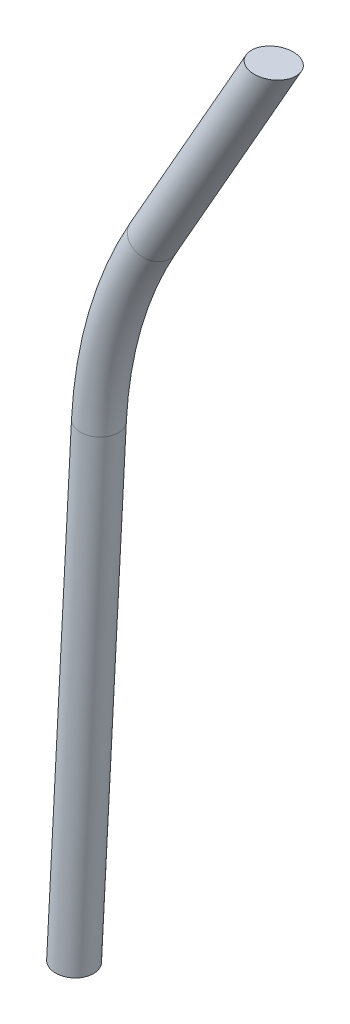
ISO-10303-21;
HEADER;
FILE_DESCRIPTION(('STEP AP214'),'2;1');
FILE_NAME('part.step','',(''),(''),'','','');
FILE_SCHEMA(('AUTOMOTIVE_DESIGN { 1 0 10303 214 1 1 1 1 }'));
ENDSEC;
DATA;
#1=APPLICATION_CONTEXT('core data for automotive mechanical design processes');
#2=APPLICATION_PROTOCOL_DEFINITION('international standard','automotive_design',2000,#1);
#3=PRODUCT_CONTEXT('',#1,'mechanical');
#4=PRODUCT('Part','Part','',(#3));
#5=PRODUCT_RELATED_PRODUCT_CATEGORY('part','',(#4));
#6=PRODUCT_DEFINITION_FORMATION('','',#4);
#7=PRODUCT_DEFINITION_CONTEXT('part definition',#1,'design');
#8=PRODUCT_DEFINITION('design','',#6,#7);
#9=PRODUCT_DEFINITION_SHAPE('','',#8);
#10=(LENGTH_UNIT() NAMED_UNIT(*) SI_UNIT(.MILLI.,.METRE.));
#11=(NAMED_UNIT(*) PLANE_ANGLE_UNIT() SI_UNIT($,.RADIAN.));
#12=(NAMED_UNIT(*) SI_UNIT($,.STERADIAN.) SOLID_ANGLE_UNIT());
#13=UNCERTAINTY_MEASURE_WITH_UNIT(LENGTH_MEASURE(1.E-05),#10,'distance_accuracy_value','');
#14=(GEOMETRIC_REPRESENTATION_CONTEXT(3) GLOBAL_UNCERTAINTY_ASSIGNED_CONTEXT((#13)) GLOBAL_UNIT_ASSIGNED_CONTEXT((#10,
#11,#12)) REPRESENTATION_CONTEXT('',''));
#15=CARTESIAN_POINT('',(0.,0.,0.));
#16=DIRECTION('',(0.,0.,1.));
#17=DIRECTION('',(1.,0.,0.));
#18=AXIS2_PLACEMENT_3D('',#15,#16,#17);
#19=CARTESIAN_POINT('',(255.705553365769,1431.16122795758,0.));
#20=DIRECTION('',(-0.494904613667118,-0.868947307591778,0.));
#21=DIRECTION('',(0.868947307591778,-0.494904613667118,0.));
#22=AXIS2_PLACEMENT_3D('',#19,#20,#21);
#23=CYLINDRICAL_SURFACE('',#22,20.);
#24=CARTESIAN_POINT('',(50.5067950629261,1070.87582421639,0.));
#25=DIRECTION('',(0.494904613667118,0.868947307591778,0.));
#26=DIRECTION('',(-0.868947307591778,0.494904613667118,0.));
#27=AXIS2_PLACEMENT_3D('',#24,#25,#26);
#28=CIRCLE('',#27,20.);
#29=CARTESIAN_POINT('',(33.1278489110906,1080.77391648974,0.));
#30=VERTEX_POINT('',#29);
#31=EDGE_CURVE('E98',#30,#30,#28,.T.);
#32=ORIENTED_EDGE('',*,*,#31,.T.);
#33=EDGE_LOOP('',(#32));
#34=FACE_BOUND('',#33,.T.);
#35=CARTESIAN_POINT('',(174.738333620564,1289.,0.));
#36=DIRECTION('',(0.,1.,0.));
#37=DIRECTION('',(-1.,0.,0.));
#38=AXIS2_PLACEMENT_3D('',#35,#36,#37);
#39=ELLIPSE('',#38,23.0163553362384,20.);
#40=CARTESIAN_POINT('',(151.721978284326,1289.,0.));
#41=VERTEX_POINT('',#40);
#42=EDGE_CURVE('E67',#41,#41,#39,.T.);
#43=ORIENTED_EDGE('',*,*,#42,.F.);
#44=EDGE_LOOP('',(#43));
#45=FACE_BOUND('',#44,.T.);
#46=ADVANCED_FACE('F63',(#34,#45),#23,.T.);
#47=CARTESIAN_POINT('',(-30.8856678278379,385.094139798678,0.));
#48=DIRECTION('',(0.0516568475525954,0.998664893796176,0.));
#49=DIRECTION('',(-0.998664893796176,0.0516568475525954,0.));
#50=AXIS2_PLACEMENT_3D('',#47,#48,#49);
#51=PLANE('',#50);
#52=CARTESIAN_POINT('',(-30.8856678278379,385.094139798678,0.));
#53=DIRECTION('',(0.0516568475525954,0.998664893796176,0.));
#54=DIRECTION('',(-0.998664893796176,0.0516568475525954,0.));
#55=AXIS2_PLACEMENT_3D('',#52,#53,#54);
#56=CIRCLE('',#55,20.);
#57=CARTESIAN_POINT('',(-50.8589657037614,386.12727674973,0.));
#58=VERTEX_POINT('',#57);
#59=EDGE_CURVE('E14',#58,#58,#56,.T.);
#60=ORIENTED_EDGE('',*,*,#59,.F.);
#61=EDGE_LOOP('',(#60));
#62=FACE_BOUND('',#61,.T.);
#63=ADVANCED_FACE('F65',(#62),#51,.F.);
#64=CARTESIAN_POINT('',(424.15413732739,858.066840339532,0.));
#65=DIRECTION('',(0.,0.,1.));
#66=DIRECTION('',(1.,0.,0.));
#67=AXIS2_PLACEMENT_3D('',#64,#65,#66);
#68=TOROIDAL_SURFACE('',#67,430.,20.);
#69=CARTESIAN_POINT('',(-5.27176700496474,880.279284787147,0.));
#70=DIRECTION('',(0.0516568475525954,0.998664893796176,0.));
#71=DIRECTION('',(-0.998664893796176,0.0516568475525954,0.));
#72=AXIS2_PLACEMENT_3D('',#69,#70,#71);
#73=CIRCLE('',#72,20.);
#74=CARTESIAN_POINT('',(-25.2450648808896,881.312421738199,0.));
#75=VERTEX_POINT('',#74);
#76=EDGE_CURVE('E71',#75,#75,#73,.T.);
#77=CARTESIAN_POINT('',(424.15413732739,858.066840339532,0.));
#78=DIRECTION('',(0.,0.,1.));
#79=DIRECTION('',(1.,0.,0.));
#80=AXIS2_PLACEMENT_3D('',#77,#78,#79);
#81=CIRCLE('',#80,450.);
#82=EDGE_CURVE('',#30,#75,#81,.T.);
#83=ORIENTED_EDGE('',*,*,#31,.F.);
#84=ORIENTED_EDGE('',*,*,#76,.T.);
#85=ORIENTED_EDGE('',*,*,#82,.T.);
#86=ORIENTED_EDGE('',*,*,#82,.F.);
#87=EDGE_LOOP('',(#83,#85,#84,#86));
#88=FACE_BOUND('',#87,.T.);
#89=ADVANCED_FACE('F78',(#88),#68,.T.);
#90=CARTESIAN_POINT('',(-5.27176700496599,880.279284787147,0.));
#91=DIRECTION('',(-0.0516568475525954,-0.998664893796176,0.));
#92=DIRECTION('',(0.998664893796176,-0.0516568475525954,0.));
#93=AXIS2_PLACEMENT_3D('',#90,#91,#92);
#94=CYLINDRICAL_SURFACE('',#93,20.);
#95=ORIENTED_EDGE('',*,*,#59,.T.);
#96=EDGE_LOOP('',(#95));
#97=FACE_BOUND('',#96,.T.);
#98=ORIENTED_EDGE('',*,*,#76,.F.);
#99=EDGE_LOOP('',(#98));
#100=FACE_BOUND('',#99,.T.);
#101=ADVANCED_FACE('F74',(#97,#100),#94,.T.);
#102=CARTESIAN_POINT('',(0.,1289.,0.));
#103=DIRECTION('',(0.,1.,0.));
#104=DIRECTION('',(0.,0.,1.));
#105=AXIS2_PLACEMENT_3D('',#102,#103,#104);
#106=PLANE('',#105);
#107=ORIENTED_EDGE('',*,*,#42,.T.);
#108=EDGE_LOOP('',(#107));
#109=FACE_BOUND('',#108,.T.);
#110=ADVANCED_FACE('F79',(#109),#106,.T.);
#111=CLOSED_SHELL('',(#46,#63,#89,#101,#110));
#112=MANIFOLD_SOLID_BREP('B2',#111);
#113=ADVANCED_BREP_SHAPE_REPRESENTATION('',(#18,#112),#14);
#114=SHAPE_DEFINITION_REPRESENTATION(#9,#113);
ENDSEC;
END-ISO-10303-21;
